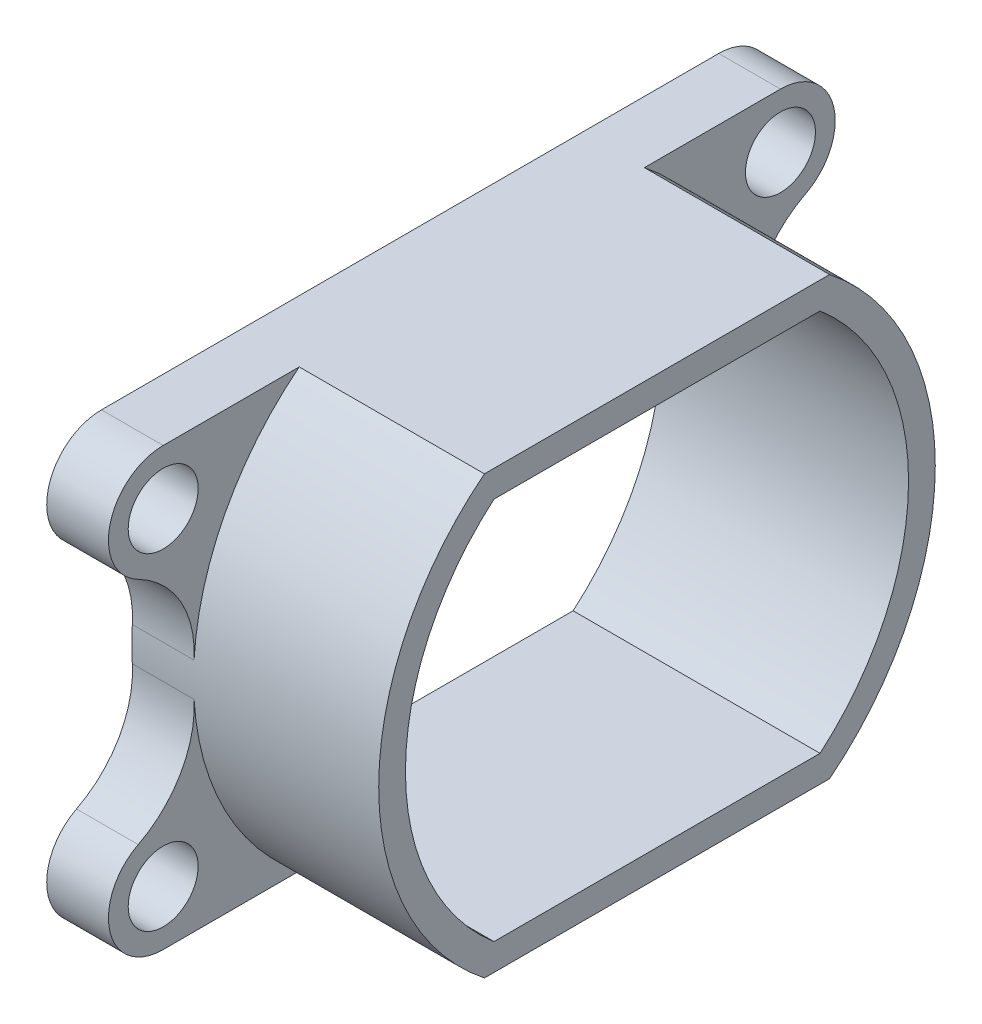
ISO-10303-21;
HEADER;
FILE_DESCRIPTION(('STEP AP214'),'2;1');
FILE_NAME('part.step','',(''),(''),'','','');
FILE_SCHEMA(('AUTOMOTIVE_DESIGN { 1 0 10303 214 1 1 1 1 }'));
ENDSEC;
DATA;
#1=APPLICATION_CONTEXT('core data for automotive mechanical design processes');
#2=APPLICATION_PROTOCOL_DEFINITION('international standard','automotive_design',2000,#1);
#3=PRODUCT_CONTEXT('',#1,'mechanical');
#4=PRODUCT('Part','Part','',(#3));
#5=PRODUCT_RELATED_PRODUCT_CATEGORY('part','',(#4));
#6=PRODUCT_DEFINITION_FORMATION('','',#4);
#7=PRODUCT_DEFINITION_CONTEXT('part definition',#1,'design');
#8=PRODUCT_DEFINITION('design','',#6,#7);
#9=PRODUCT_DEFINITION_SHAPE('','',#8);
#10=(LENGTH_UNIT() NAMED_UNIT(*) SI_UNIT(.MILLI.,.METRE.));
#11=(NAMED_UNIT(*) PLANE_ANGLE_UNIT() SI_UNIT($,.RADIAN.));
#12=(NAMED_UNIT(*) SI_UNIT($,.STERADIAN.) SOLID_ANGLE_UNIT());
#13=UNCERTAINTY_MEASURE_WITH_UNIT(LENGTH_MEASURE(1.E-05),#10,'distance_accuracy_value','');
#14=(GEOMETRIC_REPRESENTATION_CONTEXT(3) GLOBAL_UNCERTAINTY_ASSIGNED_CONTEXT((#13)) GLOBAL_UNIT_ASSIGNED_CONTEXT((#10,
#11,#12)) REPRESENTATION_CONTEXT('',''));
#15=CARTESIAN_POINT('',(0.,0.,0.));
#16=DIRECTION('',(0.,0.,1.));
#17=DIRECTION('',(1.,0.,0.));
#18=AXIS2_PLACEMENT_3D('',#15,#16,#17);
#19=CARTESIAN_POINT('',(12.,0.,0.));
#20=DIRECTION('',(-1.,0.,0.));
#21=DIRECTION('',(0.,0.,1.));
#22=AXIS2_PLACEMENT_3D('',#19,#20,#21);
#23=CYLINDRICAL_SURFACE('',#22,13.525);
#24=CARTESIAN_POINT('',(0.,0.,0.));
#25=DIRECTION('',(1.,0.,0.));
#26=DIRECTION('',(0.,0.,-1.));
#27=AXIS2_PLACEMENT_3D('',#24,#25,#26);
#28=CIRCLE('',#27,13.525);
#29=CARTESIAN_POINT('',(0.,0.826066463889433,13.4997495975754));
#30=VERTEX_POINT('',#29);
#31=CARTESIAN_POINT('',(0.,-0.826066463889429,13.4997495975754));
#32=VERTEX_POINT('',#31);
#33=EDGE_CURVE('E297',#30,#32,#28,.T.);
#34=ORIENTED_EDGE('',*,*,#33,.T.);
#35=DIRECTION('',(-1.,0.,0.));
#36=VECTOR('',#35,1.);
#37=CARTESIAN_POINT('',(12.,-0.826066463889429,13.4997495975754));
#38=LINE('',#37,#36);
#39=CARTESIAN_POINT('',(3.,-0.826066463889429,13.4997495975754));
#40=VERTEX_POINT('',#39);
#41=EDGE_CURVE('E342',#32,#40,#38,.F.);
#42=ORIENTED_EDGE('',*,*,#41,.T.);
#43=CARTESIAN_POINT('',(3.,0.,0.));
#44=DIRECTION('',(-1.,0.,0.));
#45=DIRECTION('',(0.,0.,1.));
#46=AXIS2_PLACEMENT_3D('',#43,#44,#45);
#47=CIRCLE('',#46,13.525);
#48=CARTESIAN_POINT('',(3.,-10.61,8.38770081726812));
#49=VERTEX_POINT('',#48);
#50=EDGE_CURVE('E218',#49,#40,#47,.T.);
#51=ORIENTED_EDGE('',*,*,#50,.F.);
#52=DIRECTION('',(-1.,0.,0.));
#53=VECTOR('',#52,1.);
#54=CARTESIAN_POINT('',(12.,-10.61,8.38770081726812));
#55=LINE('',#54,#53);
#56=CARTESIAN_POINT('',(12.,-10.61,8.38770081726812));
#57=VERTEX_POINT('',#56);
#58=EDGE_CURVE('E322',#57,#49,#55,.T.);
#59=ORIENTED_EDGE('',*,*,#58,.F.);
#60=CARTESIAN_POINT('',(12.,0.,0.));
#61=DIRECTION('',(1.,0.,0.));
#62=DIRECTION('',(0.,0.,-1.));
#63=AXIS2_PLACEMENT_3D('',#60,#61,#62);
#64=CIRCLE('',#63,13.525);
#65=CARTESIAN_POINT('',(12.,10.61,8.38770081726812));
#66=VERTEX_POINT('',#65);
#67=EDGE_CURVE('E298',#66,#57,#64,.T.);
#68=ORIENTED_EDGE('',*,*,#67,.F.);
#69=DIRECTION('',(-1.,0.,0.));
#70=VECTOR('',#69,1.);
#71=CARTESIAN_POINT('',(12.,10.61,8.38770081726812));
#72=LINE('',#71,#70);
#73=CARTESIAN_POINT('',(3.,10.61,8.38770081726812));
#74=VERTEX_POINT('',#73);
#75=EDGE_CURVE('E307',#66,#74,#72,.T.);
#76=ORIENTED_EDGE('',*,*,#75,.T.);
#77=CARTESIAN_POINT('',(3.,0.,0.));
#78=DIRECTION('',(-1.,0.,0.));
#79=DIRECTION('',(0.,0.,1.));
#80=AXIS2_PLACEMENT_3D('',#77,#78,#79);
#81=CIRCLE('',#80,13.525);
#82=CARTESIAN_POINT('',(3.,0.826066463889433,13.4997495975754));
#83=VERTEX_POINT('',#82);
#84=EDGE_CURVE('E185',#83,#74,#81,.T.);
#85=ORIENTED_EDGE('',*,*,#84,.F.);
#86=DIRECTION('',(-1.,0.,0.));
#87=VECTOR('',#86,1.);
#88=CARTESIAN_POINT('',(12.,0.826066463889433,13.4997495975754));
#89=LINE('',#88,#87);
#90=EDGE_CURVE('E339',#83,#30,#89,.T.);
#91=ORIENTED_EDGE('',*,*,#90,.T.);
#92=EDGE_LOOP('',(#34,#42,#51,#59,#68,#76,#85,#91));
#93=FACE_BOUND('',#92,.T.);
#94=ADVANCED_FACE('F41',(#93),#23,.T.);
#95=CARTESIAN_POINT('',(12.,0.,0.));
#96=DIRECTION('',(-1.,0.,0.));
#97=DIRECTION('',(0.,0.,1.));
#98=AXIS2_PLACEMENT_3D('',#95,#96,#97);
#99=CYLINDRICAL_SURFACE('',#98,13.525);
#100=CARTESIAN_POINT('',(3.,0.,0.));
#101=DIRECTION('',(-1.,0.,0.));
#102=DIRECTION('',(0.,0.,1.));
#103=AXIS2_PLACEMENT_3D('',#100,#101,#102);
#104=CIRCLE('',#103,13.525);
#105=CARTESIAN_POINT('',(3.,-0.826066463889431,-13.4997495975754));
#106=VERTEX_POINT('',#105);
#107=CARTESIAN_POINT('',(3.,-10.61,-8.38770081726812));
#108=VERTEX_POINT('',#107);
#109=EDGE_CURVE('E234',#106,#108,#104,.T.);
#110=ORIENTED_EDGE('',*,*,#109,.F.);
#111=DIRECTION('',(-1.,0.,0.));
#112=VECTOR('',#111,1.);
#113=CARTESIAN_POINT('',(12.,-0.826066463889431,-13.4997495975754));
#114=LINE('',#113,#112);
#115=CARTESIAN_POINT('',(0.,-0.826066463889431,-13.4997495975754));
#116=VERTEX_POINT('',#115);
#117=EDGE_CURVE('E328',#106,#116,#114,.T.);
#118=ORIENTED_EDGE('',*,*,#117,.T.);
#119=CARTESIAN_POINT('',(0.,0.,0.));
#120=DIRECTION('',(1.,0.,0.));
#121=DIRECTION('',(0.,0.,-1.));
#122=AXIS2_PLACEMENT_3D('',#119,#120,#121);
#123=CIRCLE('',#122,13.525);
#124=CARTESIAN_POINT('',(0.,0.826066463889426,-13.4997495975754));
#125=VERTEX_POINT('',#124);
#126=EDGE_CURVE('E312',#116,#125,#123,.T.);
#127=ORIENTED_EDGE('',*,*,#126,.T.);
#128=DIRECTION('',(-1.,0.,0.));
#129=VECTOR('',#128,1.);
#130=CARTESIAN_POINT('',(12.,0.826066463889426,-13.4997495975754));
#131=LINE('',#130,#129);
#132=CARTESIAN_POINT('',(3.,0.826066463889426,-13.4997495975754));
#133=VERTEX_POINT('',#132);
#134=EDGE_CURVE('E325',#125,#133,#131,.F.);
#135=ORIENTED_EDGE('',*,*,#134,.T.);
#136=CARTESIAN_POINT('',(3.,0.,0.));
#137=DIRECTION('',(-1.,0.,0.));
#138=DIRECTION('',(0.,0.,1.));
#139=AXIS2_PLACEMENT_3D('',#136,#137,#138);
#140=CIRCLE('',#139,13.525);
#141=CARTESIAN_POINT('',(3.,10.61,-8.38770081726812));
#142=VERTEX_POINT('',#141);
#143=EDGE_CURVE('E258',#142,#133,#140,.T.);
#144=ORIENTED_EDGE('',*,*,#143,.F.);
#145=DIRECTION('',(-1.,0.,0.));
#146=VECTOR('',#145,1.);
#147=CARTESIAN_POINT('',(12.,10.61,-8.38770081726812));
#148=LINE('',#147,#146);
#149=CARTESIAN_POINT('',(12.,10.61,-8.38770081726812));
#150=VERTEX_POINT('',#149);
#151=EDGE_CURVE('E317',#150,#142,#148,.T.);
#152=ORIENTED_EDGE('',*,*,#151,.F.);
#153=CARTESIAN_POINT('',(12.,0.,0.));
#154=DIRECTION('',(1.,0.,0.));
#155=DIRECTION('',(0.,0.,-1.));
#156=AXIS2_PLACEMENT_3D('',#153,#154,#155);
#157=CIRCLE('',#156,13.525);
#158=CARTESIAN_POINT('',(12.,-10.61,-8.38770081726812));
#159=VERTEX_POINT('',#158);
#160=EDGE_CURVE('E303',#159,#150,#157,.T.);
#161=ORIENTED_EDGE('',*,*,#160,.F.);
#162=DIRECTION('',(-1.,0.,0.));
#163=VECTOR('',#162,1.);
#164=CARTESIAN_POINT('',(12.,-10.61,-8.38770081726812));
#165=LINE('',#164,#163);
#166=EDGE_CURVE('E320',#159,#108,#165,.T.);
#167=ORIENTED_EDGE('',*,*,#166,.T.);
#168=EDGE_LOOP('',(#110,#118,#127,#135,#144,#152,#161,#167));
#169=FACE_BOUND('',#168,.T.);
#170=ADVANCED_FACE('F381',(#169),#99,.T.);
#171=CARTESIAN_POINT('',(12.,0.,0.));
#172=DIRECTION('',(1.,0.,0.));
#173=DIRECTION('',(0.,0.,-1.));
#174=AXIS2_PLACEMENT_3D('',#171,#172,#173);
#175=PLANE('',#174);
#176=ORIENTED_EDGE('',*,*,#67,.T.);
#177=DIRECTION('',(0.,0.,-1.));
#178=VECTOR('',#177,1.);
#179=CARTESIAN_POINT('',(12.,-10.61,8.38770081726812));
#180=LINE('',#179,#178);
#181=EDGE_CURVE('E301',#57,#159,#180,.T.);
#182=ORIENTED_EDGE('',*,*,#181,.T.);
#183=ORIENTED_EDGE('',*,*,#160,.T.);
#184=DIRECTION('',(0.,0.,1.));
#185=VECTOR('',#184,1.);
#186=CARTESIAN_POINT('',(12.,10.61,8.38770081726812));
#187=LINE('',#186,#185);
#188=EDGE_CURVE('E305',#150,#66,#187,.T.);
#189=ORIENTED_EDGE('',*,*,#188,.T.);
#190=EDGE_LOOP('',(#176,#182,#183,#189));
#191=FACE_BOUND('',#190,.T.);
#192=DIRECTION('',(0.,0.,-1.));
#193=VECTOR('',#192,1.);
#194=CARTESIAN_POINT('',(12.,-9.31,7.9230376119264));
#195=LINE('',#194,#193);
#196=CARTESIAN_POINT('',(12.,-9.31,7.9230376119264));
#197=VERTEX_POINT('',#196);
#198=CARTESIAN_POINT('',(12.,-9.31,-7.9230376119264));
#199=VERTEX_POINT('',#198);
#200=EDGE_CURVE('E269',#197,#199,#195,.T.);
#201=ORIENTED_EDGE('',*,*,#200,.F.);
#202=CARTESIAN_POINT('',(12.,0.,0.));
#203=DIRECTION('',(1.,0.,0.));
#204=DIRECTION('',(0.,0.,-1.));
#205=AXIS2_PLACEMENT_3D('',#202,#203,#204);
#206=CIRCLE('',#205,12.225);
#207=CARTESIAN_POINT('',(12.,9.31,7.9230376119264));
#208=VERTEX_POINT('',#207);
#209=EDGE_CURVE('E267',#208,#197,#206,.T.);
#210=ORIENTED_EDGE('',*,*,#209,.F.);
#211=DIRECTION('',(0.,0.,1.));
#212=VECTOR('',#211,1.);
#213=CARTESIAN_POINT('',(12.,9.31,7.9230376119264));
#214=LINE('',#213,#212);
#215=CARTESIAN_POINT('',(12.,9.31,-7.9230376119264));
#216=VERTEX_POINT('',#215);
#217=EDGE_CURVE('E275',#216,#208,#214,.T.);
#218=ORIENTED_EDGE('',*,*,#217,.F.);
#219=CARTESIAN_POINT('',(12.,0.,0.));
#220=DIRECTION('',(1.,0.,0.));
#221=DIRECTION('',(0.,0.,-1.));
#222=AXIS2_PLACEMENT_3D('',#219,#220,#221);
#223=CIRCLE('',#222,12.225);
#224=EDGE_CURVE('E272',#199,#216,#223,.T.);
#225=ORIENTED_EDGE('',*,*,#224,.F.);
#226=EDGE_LOOP('',(#201,#210,#218,#225));
#227=FACE_BOUND('',#226,.T.);
#228=ADVANCED_FACE('F387',(#191,#227),#175,.T.);
#229=CARTESIAN_POINT('',(0.,0.,0.));
#230=DIRECTION('',(1.,0.,0.));
#231=DIRECTION('',(0.,0.,-1.));
#232=AXIS2_PLACEMENT_3D('',#229,#230,#231);
#233=PLANE('',#232);
#234=ORIENTED_EDGE('',*,*,#33,.F.);
#235=CARTESIAN_POINT('',(0.,1.1314514782663,18.4904148831855));
#236=DIRECTION('',(1.,0.,0.));
#237=DIRECTION('',(0.,0.,-1.));
#238=AXIS2_PLACEMENT_3D('',#235,#236,#237);
#239=CIRCLE('',#238,5.);
#240=CARTESIAN_POINT('',(0.,5.58220116608203,16.2120761865892));
#241=VERTEX_POINT('',#240);
#242=EDGE_CURVE('E49',#30,#241,#239,.T.);
#243=ORIENTED_EDGE('',*,*,#242,.T.);
#244=CARTESIAN_POINT('',(0.,7.95,15.));
#245=DIRECTION('',(-1.,0.,0.));
#246=DIRECTION('',(0.,0.,1.));
#247=AXIS2_PLACEMENT_3D('',#244,#245,#246);
#248=CIRCLE('',#247,2.66);
#249=CARTESIAN_POINT('',(0.,10.61,15.));
#250=VERTEX_POINT('',#249);
#251=EDGE_CURVE('E201',#250,#241,#248,.F.);
#252=ORIENTED_EDGE('',*,*,#251,.F.);
#253=DIRECTION('',(0.,0.,1.));
#254=VECTOR('',#253,1.);
#255=CARTESIAN_POINT('',(0.,10.61,8.38770081726812));
#256=LINE('',#255,#254);
#257=CARTESIAN_POINT('',(0.,10.61,-15.));
#258=VERTEX_POINT('',#257);
#259=EDGE_CURVE('E193',#258,#250,#256,.T.);
#260=ORIENTED_EDGE('',*,*,#259,.F.);
#261=CARTESIAN_POINT('',(0.,7.94999999999999,-15.));
#262=DIRECTION('',(-1.,0.,0.));
#263=DIRECTION('',(0.,0.,1.));
#264=AXIS2_PLACEMENT_3D('',#261,#262,#263);
#265=CIRCLE('',#264,2.66);
#266=CARTESIAN_POINT('',(0.,5.58220116608203,-16.2120761865892));
#267=VERTEX_POINT('',#266);
#268=EDGE_CURVE('E252',#258,#267,#265,.T.);
#269=ORIENTED_EDGE('',*,*,#268,.T.);
#270=CARTESIAN_POINT('',(0.,1.13145147826629,-18.4904148831855));
#271=DIRECTION('',(1.,0.,0.));
#272=DIRECTION('',(0.,0.,-1.));
#273=AXIS2_PLACEMENT_3D('',#270,#271,#272);
#274=CIRCLE('',#273,5.);
#275=EDGE_CURVE('E351',#267,#125,#274,.T.);
#276=ORIENTED_EDGE('',*,*,#275,.T.);
#277=ORIENTED_EDGE('',*,*,#126,.F.);
#278=CARTESIAN_POINT('',(0.,-1.1314514782663,-18.4904148831855));
#279=DIRECTION('',(1.,0.,0.));
#280=DIRECTION('',(0.,0.,-1.));
#281=AXIS2_PLACEMENT_3D('',#278,#279,#280);
#282=CIRCLE('',#281,5.);
#283=CARTESIAN_POINT('',(0.,-5.58220116608203,-16.2120761865892));
#284=VERTEX_POINT('',#283);
#285=EDGE_CURVE('E346',#116,#284,#282,.T.);
#286=ORIENTED_EDGE('',*,*,#285,.T.);
#287=CARTESIAN_POINT('',(0.,-7.95,-15.));
#288=DIRECTION('',(-1.,0.,0.));
#289=DIRECTION('',(0.,0.,1.));
#290=AXIS2_PLACEMENT_3D('',#287,#288,#289);
#291=CIRCLE('',#290,2.66);
#292=CARTESIAN_POINT('',(0.,-10.61,-15.));
#293=VERTEX_POINT('',#292);
#294=EDGE_CURVE('E227',#293,#284,#291,.F.);
#295=ORIENTED_EDGE('',*,*,#294,.F.);
#296=DIRECTION('',(0.,0.,-1.));
#297=VECTOR('',#296,1.);
#298=CARTESIAN_POINT('',(0.,-10.61,8.38770081726812));
#299=LINE('',#298,#297);
#300=CARTESIAN_POINT('',(0.,-10.61,15.));
#301=VERTEX_POINT('',#300);
#302=EDGE_CURVE('E310',#301,#293,#299,.T.);
#303=ORIENTED_EDGE('',*,*,#302,.F.);
#304=CARTESIAN_POINT('',(0.,-7.95,15.));
#305=DIRECTION('',(-1.,0.,0.));
#306=DIRECTION('',(0.,0.,1.));
#307=AXIS2_PLACEMENT_3D('',#304,#305,#306);
#308=CIRCLE('',#307,2.66);
#309=CARTESIAN_POINT('',(0.,-5.58220116608203,16.2120761865892));
#310=VERTEX_POINT('',#309);
#311=EDGE_CURVE('E212',#301,#310,#308,.T.);
#312=ORIENTED_EDGE('',*,*,#311,.T.);
#313=CARTESIAN_POINT('',(0.,-1.1314514782663,18.4904148831855));
#314=DIRECTION('',(1.,0.,0.));
#315=DIRECTION('',(0.,0.,-1.));
#316=AXIS2_PLACEMENT_3D('',#313,#314,#315);
#317=CIRCLE('',#316,5.);
#318=EDGE_CURVE('E355',#310,#32,#317,.T.);
#319=ORIENTED_EDGE('',*,*,#318,.T.);
#320=EDGE_LOOP('',(#234,#243,#252,#260,#269,#276,#277,#286,#295,#303,#312,#319));
#321=FACE_BOUND('',#320,.T.);
#322=CARTESIAN_POINT('',(0.,0.,0.));
#323=DIRECTION('',(1.,0.,0.));
#324=DIRECTION('',(0.,0.,-1.));
#325=AXIS2_PLACEMENT_3D('',#322,#323,#324);
#326=CIRCLE('',#325,12.225);
#327=CARTESIAN_POINT('',(0.,9.31,7.9230376119264));
#328=VERTEX_POINT('',#327);
#329=CARTESIAN_POINT('',(0.,-9.31,7.9230376119264));
#330=VERTEX_POINT('',#329);
#331=EDGE_CURVE('E266',#328,#330,#326,.T.);
#332=ORIENTED_EDGE('',*,*,#331,.T.);
#333=DIRECTION('',(0.,0.,-1.));
#334=VECTOR('',#333,1.);
#335=CARTESIAN_POINT('',(0.,-9.31,7.9230376119264));
#336=LINE('',#335,#334);
#337=CARTESIAN_POINT('',(0.,-9.31,-7.9230376119264));
#338=VERTEX_POINT('',#337);
#339=EDGE_CURVE('E280',#330,#338,#336,.T.);
#340=ORIENTED_EDGE('',*,*,#339,.T.);
#341=CARTESIAN_POINT('',(0.,0.,0.));
#342=DIRECTION('',(1.,0.,0.));
#343=DIRECTION('',(0.,0.,-1.));
#344=AXIS2_PLACEMENT_3D('',#341,#342,#343);
#345=CIRCLE('',#344,12.225);
#346=CARTESIAN_POINT('',(0.,9.31,-7.9230376119264));
#347=VERTEX_POINT('',#346);
#348=EDGE_CURVE('E283',#338,#347,#345,.T.);
#349=ORIENTED_EDGE('',*,*,#348,.T.);
#350=DIRECTION('',(0.,0.,1.));
#351=VECTOR('',#350,1.);
#352=CARTESIAN_POINT('',(0.,9.31,7.9230376119264));
#353=LINE('',#352,#351);
#354=EDGE_CURVE('E270',#347,#328,#353,.T.);
#355=ORIENTED_EDGE('',*,*,#354,.T.);
#356=EDGE_LOOP('',(#332,#340,#349,#355));
#357=FACE_BOUND('',#356,.T.);
#358=CARTESIAN_POINT('',(0.,7.94999999999999,-15.));
#359=DIRECTION('',(-1.,0.,0.));
#360=DIRECTION('',(0.,0.,1.));
#361=AXIS2_PLACEMENT_3D('',#358,#359,#360);
#362=CIRCLE('',#361,1.7);
#363=CARTESIAN_POINT('',(0.,7.94999999999999,-13.3));
#364=VERTEX_POINT('',#363);
#365=EDGE_CURVE('E247',#364,#364,#362,.F.);
#366=ORIENTED_EDGE('',*,*,#365,.T.);
#367=EDGE_LOOP('',(#366));
#368=FACE_BOUND('',#367,.T.);
#369=CARTESIAN_POINT('',(0.,-7.95,-15.));
#370=DIRECTION('',(-1.,0.,0.));
#371=DIRECTION('',(0.,0.,1.));
#372=AXIS2_PLACEMENT_3D('',#369,#370,#371);
#373=CIRCLE('',#372,1.7);
#374=CARTESIAN_POINT('',(0.,-7.95,-13.3));
#375=VERTEX_POINT('',#374);
#376=EDGE_CURVE('E232',#375,#375,#373,.T.);
#377=ORIENTED_EDGE('',*,*,#376,.F.);
#378=EDGE_LOOP('',(#377));
#379=FACE_BOUND('',#378,.T.);
#380=CARTESIAN_POINT('',(0.,-7.95,15.));
#381=DIRECTION('',(-1.,0.,0.));
#382=DIRECTION('',(0.,0.,1.));
#383=AXIS2_PLACEMENT_3D('',#380,#381,#382);
#384=CIRCLE('',#383,1.7);
#385=CARTESIAN_POINT('',(0.,-7.95,16.7));
#386=VERTEX_POINT('',#385);
#387=EDGE_CURVE('E194',#386,#386,#384,.F.);
#388=ORIENTED_EDGE('',*,*,#387,.T.);
#389=EDGE_LOOP('',(#388));
#390=FACE_BOUND('',#389,.T.);
#391=CARTESIAN_POINT('',(0.,7.95,15.));
#392=DIRECTION('',(-1.,0.,0.));
#393=DIRECTION('',(0.,0.,1.));
#394=AXIS2_PLACEMENT_3D('',#391,#392,#393);
#395=CIRCLE('',#394,1.7);
#396=CARTESIAN_POINT('',(0.,7.95,16.7));
#397=VERTEX_POINT('',#396);
#398=EDGE_CURVE('E198',#397,#397,#395,.T.);
#399=ORIENTED_EDGE('',*,*,#398,.F.);
#400=EDGE_LOOP('',(#399));
#401=FACE_BOUND('',#400,.T.);
#402=ADVANCED_FACE('F370',(#321,#357,#368,#379,#390,#401),#233,.F.);
#403=CARTESIAN_POINT('',(12.,-10.61,8.38770081726812));
#404=DIRECTION('',(0.,1.,0.));
#405=DIRECTION('',(0.,0.,1.));
#406=AXIS2_PLACEMENT_3D('',#403,#404,#405);
#407=PLANE('',#406);
#408=ORIENTED_EDGE('',*,*,#302,.T.);
#409=DIRECTION('',(-1.,0.,0.));
#410=VECTOR('',#409,1.);
#411=CARTESIAN_POINT('',(3.,-10.61,-15.));
#412=LINE('',#411,#410);
#413=CARTESIAN_POINT('',(3.,-10.61,-15.));
#414=VERTEX_POINT('',#413);
#415=EDGE_CURVE('E240',#414,#293,#412,.T.);
#416=ORIENTED_EDGE('',*,*,#415,.F.);
#417=DIRECTION('',(0.,0.,-1.));
#418=VECTOR('',#417,1.);
#419=CARTESIAN_POINT('',(3.,-10.61,0.));
#420=LINE('',#419,#418);
#421=EDGE_CURVE('E231',#108,#414,#420,.T.);
#422=ORIENTED_EDGE('',*,*,#421,.F.);
#423=ORIENTED_EDGE('',*,*,#166,.F.);
#424=ORIENTED_EDGE('',*,*,#181,.F.);
#425=ORIENTED_EDGE('',*,*,#58,.T.);
#426=DIRECTION('',(0.,0.,1.));
#427=VECTOR('',#426,1.);
#428=CARTESIAN_POINT('',(3.,-10.61,0.));
#429=LINE('',#428,#427);
#430=CARTESIAN_POINT('',(3.,-10.61,15.));
#431=VERTEX_POINT('',#430);
#432=EDGE_CURVE('E211',#49,#431,#429,.T.);
#433=ORIENTED_EDGE('',*,*,#432,.T.);
#434=DIRECTION('',(-1.,0.,0.));
#435=VECTOR('',#434,1.);
#436=CARTESIAN_POINT('',(3.,-10.61,15.));
#437=LINE('',#436,#435);
#438=EDGE_CURVE('E220',#431,#301,#437,.T.);
#439=ORIENTED_EDGE('',*,*,#438,.T.);
#440=EDGE_LOOP('',(#408,#416,#422,#423,#424,#425,#433,#439));
#441=FACE_BOUND('',#440,.T.);
#442=ADVANCED_FACE('F392',(#441),#407,.F.);
#443=CARTESIAN_POINT('',(12.,10.61,8.38770081726812));
#444=DIRECTION('',(0.,-1.,0.));
#445=DIRECTION('',(0.,0.,-1.));
#446=AXIS2_PLACEMENT_3D('',#443,#444,#445);
#447=PLANE('',#446);
#448=ORIENTED_EDGE('',*,*,#259,.T.);
#449=DIRECTION('',(-1.,0.,0.));
#450=VECTOR('',#449,1.);
#451=CARTESIAN_POINT('',(3.,10.61,15.));
#452=LINE('',#451,#450);
#453=CARTESIAN_POINT('',(3.,10.61,15.));
#454=VERTEX_POINT('',#453);
#455=EDGE_CURVE('E190',#454,#250,#452,.T.);
#456=ORIENTED_EDGE('',*,*,#455,.F.);
#457=DIRECTION('',(0.,0.,1.));
#458=VECTOR('',#457,1.);
#459=CARTESIAN_POINT('',(3.,10.61,0.));
#460=LINE('',#459,#458);
#461=EDGE_CURVE('E179',#74,#454,#460,.T.);
#462=ORIENTED_EDGE('',*,*,#461,.F.);
#463=ORIENTED_EDGE('',*,*,#75,.F.);
#464=ORIENTED_EDGE('',*,*,#188,.F.);
#465=ORIENTED_EDGE('',*,*,#151,.T.);
#466=DIRECTION('',(0.,0.,-1.));
#467=VECTOR('',#466,1.);
#468=CARTESIAN_POINT('',(3.,10.61,0.));
#469=LINE('',#468,#467);
#470=CARTESIAN_POINT('',(3.,10.61,-15.));
#471=VERTEX_POINT('',#470);
#472=EDGE_CURVE('E251',#142,#471,#469,.T.);
#473=ORIENTED_EDGE('',*,*,#472,.T.);
#474=DIRECTION('',(-1.,0.,0.));
#475=VECTOR('',#474,1.);
#476=CARTESIAN_POINT('',(3.,10.61,-15.));
#477=LINE('',#476,#475);
#478=EDGE_CURVE('E260',#471,#258,#477,.T.);
#479=ORIENTED_EDGE('',*,*,#478,.T.);
#480=EDGE_LOOP('',(#448,#456,#462,#463,#464,#465,#473,#479));
#481=FACE_BOUND('',#480,.T.);
#482=ADVANCED_FACE('F191',(#481),#447,.F.);
#483=CARTESIAN_POINT('',(12.,0.,0.));
#484=DIRECTION('',(-1.,0.,0.));
#485=DIRECTION('',(0.,0.,1.));
#486=AXIS2_PLACEMENT_3D('',#483,#484,#485);
#487=CYLINDRICAL_SURFACE('',#486,12.225);
#488=ORIENTED_EDGE('',*,*,#331,.F.);
#489=DIRECTION('',(-1.,0.,0.));
#490=VECTOR('',#489,1.);
#491=CARTESIAN_POINT('',(12.,9.31,7.9230376119264));
#492=LINE('',#491,#490);
#493=EDGE_CURVE('E277',#208,#328,#492,.T.);
#494=ORIENTED_EDGE('',*,*,#493,.F.);
#495=ORIENTED_EDGE('',*,*,#209,.T.);
#496=DIRECTION('',(-1.,0.,0.));
#497=VECTOR('',#496,1.);
#498=CARTESIAN_POINT('',(12.,-9.31,7.9230376119264));
#499=LINE('',#498,#497);
#500=EDGE_CURVE('E294',#197,#330,#499,.T.);
#501=ORIENTED_EDGE('',*,*,#500,.T.);
#502=EDGE_LOOP('',(#488,#494,#495,#501));
#503=FACE_BOUND('',#502,.T.);
#504=ADVANCED_FACE('F449',(#503),#487,.F.);
#505=CARTESIAN_POINT('',(12.,-9.31,7.9230376119264));
#506=DIRECTION('',(0.,1.,0.));
#507=DIRECTION('',(0.,0.,1.));
#508=AXIS2_PLACEMENT_3D('',#505,#506,#507);
#509=PLANE('',#508);
#510=ORIENTED_EDGE('',*,*,#339,.F.);
#511=ORIENTED_EDGE('',*,*,#500,.F.);
#512=ORIENTED_EDGE('',*,*,#200,.T.);
#513=DIRECTION('',(-1.,0.,0.));
#514=VECTOR('',#513,1.);
#515=CARTESIAN_POINT('',(12.,-9.31,-7.9230376119264));
#516=LINE('',#515,#514);
#517=EDGE_CURVE('E292',#199,#338,#516,.T.);
#518=ORIENTED_EDGE('',*,*,#517,.T.);
#519=EDGE_LOOP('',(#510,#511,#512,#518));
#520=FACE_BOUND('',#519,.T.);
#521=ADVANCED_FACE('F442',(#520),#509,.T.);
#522=CARTESIAN_POINT('',(12.,0.,0.));
#523=DIRECTION('',(-1.,0.,0.));
#524=DIRECTION('',(0.,0.,1.));
#525=AXIS2_PLACEMENT_3D('',#522,#523,#524);
#526=CYLINDRICAL_SURFACE('',#525,12.225);
#527=ORIENTED_EDGE('',*,*,#348,.F.);
#528=ORIENTED_EDGE('',*,*,#517,.F.);
#529=ORIENTED_EDGE('',*,*,#224,.T.);
#530=DIRECTION('',(-1.,0.,0.));
#531=VECTOR('',#530,1.);
#532=CARTESIAN_POINT('',(12.,9.31,-7.9230376119264));
#533=LINE('',#532,#531);
#534=EDGE_CURVE('E290',#216,#347,#533,.T.);
#535=ORIENTED_EDGE('',*,*,#534,.T.);
#536=EDGE_LOOP('',(#527,#528,#529,#535));
#537=FACE_BOUND('',#536,.T.);
#538=ADVANCED_FACE('F445',(#537),#526,.F.);
#539=CARTESIAN_POINT('',(12.,9.31,7.9230376119264));
#540=DIRECTION('',(0.,-1.,0.));
#541=DIRECTION('',(0.,0.,-1.));
#542=AXIS2_PLACEMENT_3D('',#539,#540,#541);
#543=PLANE('',#542);
#544=ORIENTED_EDGE('',*,*,#354,.F.);
#545=ORIENTED_EDGE('',*,*,#534,.F.);
#546=ORIENTED_EDGE('',*,*,#217,.T.);
#547=ORIENTED_EDGE('',*,*,#493,.T.);
#548=EDGE_LOOP('',(#544,#545,#546,#547));
#549=FACE_BOUND('',#548,.T.);
#550=ADVANCED_FACE('F452',(#549),#543,.T.);
#551=CARTESIAN_POINT('',(3.,7.94999999999999,-15.));
#552=DIRECTION('',(-1.,0.,0.));
#553=DIRECTION('',(0.,0.,1.));
#554=AXIS2_PLACEMENT_3D('',#551,#552,#553);
#555=CYLINDRICAL_SURFACE('',#554,1.7);
#556=CARTESIAN_POINT('',(3.,7.94999999999999,-15.));
#557=DIRECTION('',(-1.,0.,0.));
#558=DIRECTION('',(0.,0.,1.));
#559=AXIS2_PLACEMENT_3D('',#556,#557,#558);
#560=CIRCLE('',#559,1.7);
#561=CARTESIAN_POINT('',(3.,7.94999999999999,-13.3));
#562=VERTEX_POINT('',#561);
#563=EDGE_CURVE('E248',#562,#562,#560,.F.);
#564=ORIENTED_EDGE('',*,*,#563,.T.);
#565=EDGE_LOOP('',(#564));
#566=FACE_BOUND('',#565,.T.);
#567=ORIENTED_EDGE('',*,*,#365,.F.);
#568=EDGE_LOOP('',(#567));
#569=FACE_BOUND('',#568,.T.);
#570=ADVANCED_FACE('F454',(#566,#569),#555,.F.);
#571=CARTESIAN_POINT('',(3.,7.94999999999999,-15.));
#572=DIRECTION('',(-1.,0.,0.));
#573=DIRECTION('',(0.,0.,1.));
#574=AXIS2_PLACEMENT_3D('',#571,#572,#573);
#575=CYLINDRICAL_SURFACE('',#574,2.66);
#576=CARTESIAN_POINT('',(3.,7.94999999999999,-15.));
#577=DIRECTION('',(-1.,0.,0.));
#578=DIRECTION('',(0.,0.,1.));
#579=AXIS2_PLACEMENT_3D('',#576,#577,#578);
#580=CIRCLE('',#579,2.66);
#581=CARTESIAN_POINT('',(3.,5.58220116608203,-16.2120761865892));
#582=VERTEX_POINT('',#581);
#583=EDGE_CURVE('E255',#471,#582,#580,.T.);
#584=ORIENTED_EDGE('',*,*,#583,.T.);
#585=DIRECTION('',(-1.,0.,0.));
#586=VECTOR('',#585,1.);
#587=CARTESIAN_POINT('',(3.,5.58220116608203,-16.2120761865892));
#588=LINE('',#587,#586);
#589=EDGE_CURVE('E333',#582,#267,#588,.T.);
#590=ORIENTED_EDGE('',*,*,#589,.T.);
#591=ORIENTED_EDGE('',*,*,#268,.F.);
#592=ORIENTED_EDGE('',*,*,#478,.F.);
#593=EDGE_LOOP('',(#584,#590,#591,#592));
#594=FACE_BOUND('',#593,.T.);
#595=ADVANCED_FACE('F409',(#594),#575,.T.);
#596=CARTESIAN_POINT('',(3.,0.,0.));
#597=DIRECTION('',(-1.,0.,0.));
#598=DIRECTION('',(0.,0.,1.));
#599=AXIS2_PLACEMENT_3D('',#596,#597,#598);
#600=PLANE('',#599);
#601=ORIENTED_EDGE('',*,*,#563,.F.);
#602=EDGE_LOOP('',(#601));
#603=FACE_BOUND('',#602,.T.);
#604=ORIENTED_EDGE('',*,*,#472,.F.);
#605=ORIENTED_EDGE('',*,*,#143,.T.);
#606=CARTESIAN_POINT('',(3.,1.13145147826629,-18.4904148831855));
#607=DIRECTION('',(-1.,0.,0.));
#608=DIRECTION('',(0.,0.,1.));
#609=AXIS2_PLACEMENT_3D('',#606,#607,#608);
#610=CIRCLE('',#609,5.);
#611=EDGE_CURVE('E353',#133,#582,#610,.T.);
#612=ORIENTED_EDGE('',*,*,#611,.T.);
#613=ORIENTED_EDGE('',*,*,#583,.F.);
#614=EDGE_LOOP('',(#604,#605,#612,#613));
#615=FACE_BOUND('',#614,.T.);
#616=ADVANCED_FACE('F406',(#603,#615),#600,.F.);
#617=CARTESIAN_POINT('',(3.,-7.95,-15.));
#618=DIRECTION('',(-1.,0.,0.));
#619=DIRECTION('',(0.,0.,1.));
#620=AXIS2_PLACEMENT_3D('',#617,#618,#619);
#621=CYLINDRICAL_SURFACE('',#620,2.66);
#622=ORIENTED_EDGE('',*,*,#294,.T.);
#623=DIRECTION('',(-1.,0.,0.));
#624=VECTOR('',#623,1.);
#625=CARTESIAN_POINT('',(3.,-5.58220116608203,-16.2120761865892));
#626=LINE('',#625,#624);
#627=CARTESIAN_POINT('',(3.,-5.58220116608203,-16.2120761865892));
#628=VERTEX_POINT('',#627);
#629=EDGE_CURVE('E331',#284,#628,#626,.F.);
#630=ORIENTED_EDGE('',*,*,#629,.T.);
#631=CARTESIAN_POINT('',(3.,-7.95,-15.));
#632=DIRECTION('',(-1.,0.,0.));
#633=DIRECTION('',(0.,0.,1.));
#634=AXIS2_PLACEMENT_3D('',#631,#632,#633);
#635=CIRCLE('',#634,2.66);
#636=EDGE_CURVE('E228',#414,#628,#635,.F.);
#637=ORIENTED_EDGE('',*,*,#636,.F.);
#638=ORIENTED_EDGE('',*,*,#415,.T.);
#639=EDGE_LOOP('',(#622,#630,#637,#638));
#640=FACE_BOUND('',#639,.T.);
#641=ADVANCED_FACE('F419',(#640),#621,.T.);
#642=CARTESIAN_POINT('',(3.,-7.95,-15.));
#643=DIRECTION('',(-1.,0.,0.));
#644=DIRECTION('',(0.,0.,1.));
#645=AXIS2_PLACEMENT_3D('',#642,#643,#644);
#646=CYLINDRICAL_SURFACE('',#645,1.7);
#647=CARTESIAN_POINT('',(3.,-7.95,-15.));
#648=DIRECTION('',(-1.,0.,0.));
#649=DIRECTION('',(0.,0.,1.));
#650=AXIS2_PLACEMENT_3D('',#647,#648,#649);
#651=CIRCLE('',#650,1.7);
#652=CARTESIAN_POINT('',(3.,-7.95,-13.3));
#653=VERTEX_POINT('',#652);
#654=EDGE_CURVE('E237',#653,#653,#651,.T.);
#655=ORIENTED_EDGE('',*,*,#654,.F.);
#656=EDGE_LOOP('',(#655));
#657=FACE_BOUND('',#656,.T.);
#658=ORIENTED_EDGE('',*,*,#376,.T.);
#659=EDGE_LOOP('',(#658));
#660=FACE_BOUND('',#659,.T.);
#661=ADVANCED_FACE('F523',(#657,#660),#646,.F.);
#662=CARTESIAN_POINT('',(3.,0.,0.));
#663=DIRECTION('',(-1.,0.,0.));
#664=DIRECTION('',(0.,0.,1.));
#665=AXIS2_PLACEMENT_3D('',#662,#663,#664);
#666=PLANE('',#665);
#667=ORIENTED_EDGE('',*,*,#636,.T.);
#668=CARTESIAN_POINT('',(3.,-1.1314514782663,-18.4904148831855));
#669=DIRECTION('',(-1.,0.,0.));
#670=DIRECTION('',(0.,0.,1.));
#671=AXIS2_PLACEMENT_3D('',#668,#669,#670);
#672=CIRCLE('',#671,5.);
#673=EDGE_CURVE('E348',#628,#106,#672,.T.);
#674=ORIENTED_EDGE('',*,*,#673,.T.);
#675=ORIENTED_EDGE('',*,*,#109,.T.);
#676=ORIENTED_EDGE('',*,*,#421,.T.);
#677=EDGE_LOOP('',(#667,#674,#675,#676));
#678=FACE_BOUND('',#677,.T.);
#679=ORIENTED_EDGE('',*,*,#654,.T.);
#680=EDGE_LOOP('',(#679));
#681=FACE_BOUND('',#680,.T.);
#682=ADVANCED_FACE('F424',(#678,#681),#666,.F.);
#683=CARTESIAN_POINT('',(3.,-7.95,15.));
#684=DIRECTION('',(-1.,0.,0.));
#685=DIRECTION('',(0.,0.,1.));
#686=AXIS2_PLACEMENT_3D('',#683,#684,#685);
#687=CYLINDRICAL_SURFACE('',#686,1.7);
#688=CARTESIAN_POINT('',(3.,-7.95,15.));
#689=DIRECTION('',(-1.,0.,0.));
#690=DIRECTION('',(0.,0.,1.));
#691=AXIS2_PLACEMENT_3D('',#688,#689,#690);
#692=CIRCLE('',#691,1.7);
#693=CARTESIAN_POINT('',(3.,-7.95,16.7));
#694=VERTEX_POINT('',#693);
#695=EDGE_CURVE('E208',#694,#694,#692,.F.);
#696=ORIENTED_EDGE('',*,*,#695,.T.);
#697=EDGE_LOOP('',(#696));
#698=FACE_BOUND('',#697,.T.);
#699=ORIENTED_EDGE('',*,*,#387,.F.);
#700=EDGE_LOOP('',(#699));
#701=FACE_BOUND('',#700,.T.);
#702=ADVANCED_FACE('F541',(#698,#701),#687,.F.);
#703=CARTESIAN_POINT('',(3.,-7.95,15.));
#704=DIRECTION('',(-1.,0.,0.));
#705=DIRECTION('',(0.,0.,1.));
#706=AXIS2_PLACEMENT_3D('',#703,#704,#705);
#707=CYLINDRICAL_SURFACE('',#706,2.66);
#708=CARTESIAN_POINT('',(3.,-7.95,15.));
#709=DIRECTION('',(-1.,0.,0.));
#710=DIRECTION('',(0.,0.,1.));
#711=AXIS2_PLACEMENT_3D('',#708,#709,#710);
#712=CIRCLE('',#711,2.66);
#713=CARTESIAN_POINT('',(3.,-5.58220116608203,16.2120761865892));
#714=VERTEX_POINT('',#713);
#715=EDGE_CURVE('E215',#431,#714,#712,.T.);
#716=ORIENTED_EDGE('',*,*,#715,.T.);
#717=DIRECTION('',(-1.,0.,0.));
#718=VECTOR('',#717,1.);
#719=CARTESIAN_POINT('',(3.,-5.58220116608203,16.2120761865892));
#720=LINE('',#719,#718);
#721=EDGE_CURVE('E336',#714,#310,#720,.T.);
#722=ORIENTED_EDGE('',*,*,#721,.T.);
#723=ORIENTED_EDGE('',*,*,#311,.F.);
#724=ORIENTED_EDGE('',*,*,#438,.F.);
#725=EDGE_LOOP('',(#716,#722,#723,#724));
#726=FACE_BOUND('',#725,.T.);
#727=ADVANCED_FACE('F367',(#726),#707,.T.);
#728=CARTESIAN_POINT('',(3.,0.,0.));
#729=DIRECTION('',(-1.,0.,0.));
#730=DIRECTION('',(0.,0.,1.));
#731=AXIS2_PLACEMENT_3D('',#728,#729,#730);
#732=PLANE('',#731);
#733=ORIENTED_EDGE('',*,*,#695,.F.);
#734=EDGE_LOOP('',(#733));
#735=FACE_BOUND('',#734,.T.);
#736=ORIENTED_EDGE('',*,*,#432,.F.);
#737=ORIENTED_EDGE('',*,*,#50,.T.);
#738=CARTESIAN_POINT('',(3.,-1.1314514782663,18.4904148831855));
#739=DIRECTION('',(-1.,0.,0.));
#740=DIRECTION('',(0.,0.,1.));
#741=AXIS2_PLACEMENT_3D('',#738,#739,#740);
#742=CIRCLE('',#741,5.);
#743=EDGE_CURVE('E357',#40,#714,#742,.T.);
#744=ORIENTED_EDGE('',*,*,#743,.T.);
#745=ORIENTED_EDGE('',*,*,#715,.F.);
#746=EDGE_LOOP('',(#736,#737,#744,#745));
#747=FACE_BOUND('',#746,.T.);
#748=ADVANCED_FACE('F361',(#735,#747),#732,.F.);
#749=CARTESIAN_POINT('',(3.,7.95,15.));
#750=DIRECTION('',(-1.,0.,0.));
#751=DIRECTION('',(0.,0.,1.));
#752=AXIS2_PLACEMENT_3D('',#749,#750,#751);
#753=CYLINDRICAL_SURFACE('',#752,2.66);
#754=ORIENTED_EDGE('',*,*,#251,.T.);
#755=DIRECTION('',(-1.,0.,0.));
#756=VECTOR('',#755,1.);
#757=CARTESIAN_POINT('',(3.,5.58220116608203,16.2120761865892));
#758=LINE('',#757,#756);
#759=CARTESIAN_POINT('',(3.,5.58220116608203,16.2120761865892));
#760=VERTEX_POINT('',#759);
#761=EDGE_CURVE('E56',#241,#760,#758,.F.);
#762=ORIENTED_EDGE('',*,*,#761,.T.);
#763=CARTESIAN_POINT('',(3.,7.95,15.));
#764=DIRECTION('',(-1.,0.,0.));
#765=DIRECTION('',(0.,0.,1.));
#766=AXIS2_PLACEMENT_3D('',#763,#764,#765);
#767=CIRCLE('',#766,2.66);
#768=EDGE_CURVE('E183',#454,#760,#767,.F.);
#769=ORIENTED_EDGE('',*,*,#768,.F.);
#770=ORIENTED_EDGE('',*,*,#455,.T.);
#771=EDGE_LOOP('',(#754,#762,#769,#770));
#772=FACE_BOUND('',#771,.T.);
#773=ADVANCED_FACE('F197',(#772),#753,.T.);
#774=CARTESIAN_POINT('',(3.,7.95,15.));
#775=DIRECTION('',(-1.,0.,0.));
#776=DIRECTION('',(0.,0.,1.));
#777=AXIS2_PLACEMENT_3D('',#774,#775,#776);
#778=CYLINDRICAL_SURFACE('',#777,1.7);
#779=CARTESIAN_POINT('',(3.,7.95,15.));
#780=DIRECTION('',(-1.,0.,0.));
#781=DIRECTION('',(0.,0.,1.));
#782=AXIS2_PLACEMENT_3D('',#779,#780,#781);
#783=CIRCLE('',#782,1.7);
#784=CARTESIAN_POINT('',(3.,7.95,16.7));
#785=VERTEX_POINT('',#784);
#786=EDGE_CURVE('E195',#785,#785,#783,.T.);
#787=ORIENTED_EDGE('',*,*,#786,.F.);
#788=EDGE_LOOP('',(#787));
#789=FACE_BOUND('',#788,.T.);
#790=ORIENTED_EDGE('',*,*,#398,.T.);
#791=EDGE_LOOP('',(#790));
#792=FACE_BOUND('',#791,.T.);
#793=ADVANCED_FACE('F575',(#789,#792),#778,.F.);
#794=CARTESIAN_POINT('',(3.,0.,0.));
#795=DIRECTION('',(-1.,0.,0.));
#796=DIRECTION('',(0.,0.,1.));
#797=AXIS2_PLACEMENT_3D('',#794,#795,#796);
#798=PLANE('',#797);
#799=ORIENTED_EDGE('',*,*,#768,.T.);
#800=CARTESIAN_POINT('',(3.,1.1314514782663,18.4904148831855));
#801=DIRECTION('',(-1.,0.,0.));
#802=DIRECTION('',(0.,0.,1.));
#803=AXIS2_PLACEMENT_3D('',#800,#801,#802);
#804=CIRCLE('',#803,5.);
#805=EDGE_CURVE('E11',#760,#83,#804,.T.);
#806=ORIENTED_EDGE('',*,*,#805,.T.);
#807=ORIENTED_EDGE('',*,*,#84,.T.);
#808=ORIENTED_EDGE('',*,*,#461,.T.);
#809=EDGE_LOOP('',(#799,#806,#807,#808));
#810=FACE_BOUND('',#809,.T.);
#811=ORIENTED_EDGE('',*,*,#786,.T.);
#812=EDGE_LOOP('',(#811));
#813=FACE_BOUND('',#812,.T.);
#814=ADVANCED_FACE('F181',(#810,#813),#798,.F.);
#815=CARTESIAN_POINT('',(3.,-1.1314514782663,-18.4904148831855));
#816=DIRECTION('',(1.,0.,0.));
#817=DIRECTION('',(0.,0.,-1.));
#818=AXIS2_PLACEMENT_3D('',#815,#816,#817);
#819=CYLINDRICAL_SURFACE('',#818,5.);
#820=ORIENTED_EDGE('',*,*,#673,.F.);
#821=ORIENTED_EDGE('',*,*,#629,.F.);
#822=ORIENTED_EDGE('',*,*,#285,.F.);
#823=ORIENTED_EDGE('',*,*,#117,.F.);
#824=EDGE_LOOP('',(#820,#821,#822,#823));
#825=FACE_BOUND('',#824,.T.);
#826=ADVANCED_FACE('F393',(#825),#819,.F.);
#827=CARTESIAN_POINT('',(12.,1.13145147826629,-18.4904148831855));
#828=DIRECTION('',(1.,0.,0.));
#829=DIRECTION('',(0.,0.,-1.));
#830=AXIS2_PLACEMENT_3D('',#827,#828,#829);
#831=CYLINDRICAL_SURFACE('',#830,5.);
#832=ORIENTED_EDGE('',*,*,#611,.F.);
#833=ORIENTED_EDGE('',*,*,#134,.F.);
#834=ORIENTED_EDGE('',*,*,#275,.F.);
#835=ORIENTED_EDGE('',*,*,#589,.F.);
#836=EDGE_LOOP('',(#832,#833,#834,#835));
#837=FACE_BOUND('',#836,.T.);
#838=ADVANCED_FACE('F379',(#837),#831,.F.);
#839=CARTESIAN_POINT('',(12.,-1.1314514782663,18.4904148831855));
#840=DIRECTION('',(1.,0.,0.));
#841=DIRECTION('',(0.,0.,-1.));
#842=AXIS2_PLACEMENT_3D('',#839,#840,#841);
#843=CYLINDRICAL_SURFACE('',#842,5.);
#844=ORIENTED_EDGE('',*,*,#743,.F.);
#845=ORIENTED_EDGE('',*,*,#41,.F.);
#846=ORIENTED_EDGE('',*,*,#318,.F.);
#847=ORIENTED_EDGE('',*,*,#721,.F.);
#848=EDGE_LOOP('',(#844,#845,#846,#847));
#849=FACE_BOUND('',#848,.T.);
#850=ADVANCED_FACE('F369',(#849),#843,.F.);
#851=CARTESIAN_POINT('',(3.,1.1314514782663,18.4904148831855));
#852=DIRECTION('',(1.,0.,0.));
#853=DIRECTION('',(0.,0.,-1.));
#854=AXIS2_PLACEMENT_3D('',#851,#852,#853);
#855=CYLINDRICAL_SURFACE('',#854,5.);
#856=ORIENTED_EDGE('',*,*,#805,.F.);
#857=ORIENTED_EDGE('',*,*,#761,.F.);
#858=ORIENTED_EDGE('',*,*,#242,.F.);
#859=ORIENTED_EDGE('',*,*,#90,.F.);
#860=EDGE_LOOP('',(#856,#857,#858,#859));
#861=FACE_BOUND('',#860,.T.);
#862=ADVANCED_FACE('F43',(#861),#855,.F.);
#863=CLOSED_SHELL('',(#94,#170,#228,#402,#442,#482,#504,#521,#538,#550,#570,#595,#616,#641,#661,
#682,#702,#727,#748,#773,#793,#814,#826,#838,#850,#862));
#864=MANIFOLD_SOLID_BREP('B2',#863);
#865=ADVANCED_BREP_SHAPE_REPRESENTATION('',(#18,#864),#14);
#866=SHAPE_DEFINITION_REPRESENTATION(#9,#865);
ENDSEC;
END-ISO-10303-21;
